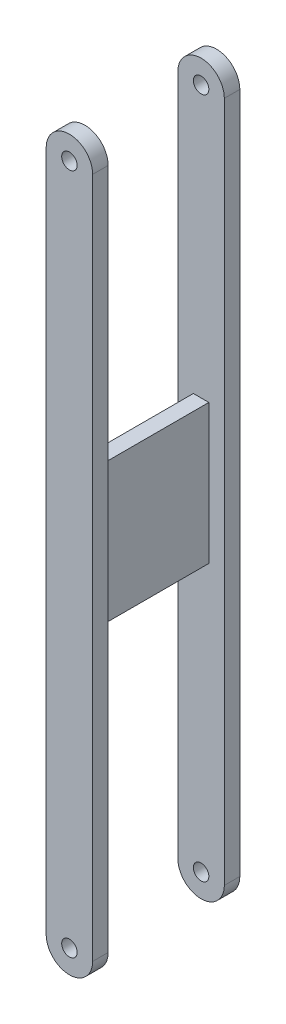
ISO-10303-21;
HEADER;
FILE_DESCRIPTION(('STEP AP214'),'2;1');
FILE_NAME('part.step','',(''),(''),'','','');
FILE_SCHEMA(('AUTOMOTIVE_DESIGN { 1 0 10303 214 1 1 1 1 }'));
ENDSEC;
DATA;
#1=APPLICATION_CONTEXT('core data for automotive mechanical design processes');
#2=APPLICATION_PROTOCOL_DEFINITION('international standard','automotive_design',2000,#1);
#3=PRODUCT_CONTEXT('',#1,'mechanical');
#4=PRODUCT('Part','Part','',(#3));
#5=PRODUCT_RELATED_PRODUCT_CATEGORY('part','',(#4));
#6=PRODUCT_DEFINITION_FORMATION('','',#4);
#7=PRODUCT_DEFINITION_CONTEXT('part definition',#1,'design');
#8=PRODUCT_DEFINITION('design','',#6,#7);
#9=PRODUCT_DEFINITION_SHAPE('','',#8);
#10=(LENGTH_UNIT() NAMED_UNIT(*) SI_UNIT(.MILLI.,.METRE.));
#11=(NAMED_UNIT(*) PLANE_ANGLE_UNIT() SI_UNIT($,.RADIAN.));
#12=(NAMED_UNIT(*) SI_UNIT($,.STERADIAN.) SOLID_ANGLE_UNIT());
#13=UNCERTAINTY_MEASURE_WITH_UNIT(LENGTH_MEASURE(1.E-05),#10,'distance_accuracy_value','');
#14=(GEOMETRIC_REPRESENTATION_CONTEXT(3) GLOBAL_UNCERTAINTY_ASSIGNED_CONTEXT((#13)) GLOBAL_UNIT_ASSIGNED_CONTEXT((#10,
#11,#12)) REPRESENTATION_CONTEXT('',''));
#15=CARTESIAN_POINT('',(0.,0.,0.));
#16=DIRECTION('',(0.,0.,1.));
#17=DIRECTION('',(1.,0.,0.));
#18=AXIS2_PLACEMENT_3D('',#15,#16,#17);
#19=CARTESIAN_POINT('',(0.,0.,4.));
#20=DIRECTION('',(0.,0.,-1.));
#21=DIRECTION('',(-1.,0.,0.));
#22=AXIS2_PLACEMENT_3D('',#19,#20,#21);
#23=PLANE('',#22);
#24=DIRECTION('',(0.,-1.,0.));
#25=VECTOR('',#24,1.);
#26=CARTESIAN_POINT('',(0.,0.,4.));
#27=LINE('',#26,#25);
#28=CARTESIAN_POINT('',(0.,182.,4.));
#29=VERTEX_POINT('',#28);
#30=CARTESIAN_POINT('',(0.,6.,4.));
#31=VERTEX_POINT('',#30);
#32=EDGE_CURVE('E210',#29,#31,#27,.T.);
#33=ORIENTED_EDGE('',*,*,#32,.T.);
#34=CARTESIAN_POINT('',(6.00000000000001,6.,4.));
#35=DIRECTION('',(0.,0.,-1.));
#36=DIRECTION('',(-1.,0.,0.));
#37=AXIS2_PLACEMENT_3D('',#34,#35,#36);
#38=CIRCLE('',#37,6.00000000000001);
#39=CARTESIAN_POINT('',(12.,6.,4.));
#40=VERTEX_POINT('',#39);
#41=EDGE_CURVE('E182',#31,#40,#38,.F.);
#42=ORIENTED_EDGE('',*,*,#41,.T.);
#43=DIRECTION('',(0.,1.,0.));
#44=VECTOR('',#43,1.);
#45=CARTESIAN_POINT('',(12.,0.,4.));
#46=LINE('',#45,#44);
#47=CARTESIAN_POINT('',(12.,182.,4.));
#48=VERTEX_POINT('',#47);
#49=EDGE_CURVE('E213',#40,#48,#46,.T.);
#50=ORIENTED_EDGE('',*,*,#49,.T.);
#51=CARTESIAN_POINT('',(6.00000000000002,182.,4.));
#52=DIRECTION('',(0.,0.,-1.));
#53=DIRECTION('',(-1.,0.,0.));
#54=AXIS2_PLACEMENT_3D('',#51,#52,#53);
#55=CIRCLE('',#54,6.00000000000001);
#56=EDGE_CURVE('E197',#48,#29,#55,.F.);
#57=ORIENTED_EDGE('',*,*,#56,.T.);
#58=EDGE_LOOP('',(#33,#42,#50,#57));
#59=FACE_BOUND('',#58,.T.);
#60=CARTESIAN_POINT('',(6.00000000000002,182.,4.));
#61=DIRECTION('',(0.,0.,-1.));
#62=DIRECTION('',(-1.,0.,0.));
#63=AXIS2_PLACEMENT_3D('',#60,#61,#62);
#64=CIRCLE('',#63,2.);
#65=CARTESIAN_POINT('',(4.00000000000002,182.,4.));
#66=VERTEX_POINT('',#65);
#67=EDGE_CURVE('E149',#66,#66,#64,.T.);
#68=ORIENTED_EDGE('',*,*,#67,.T.);
#69=EDGE_LOOP('',(#68));
#70=FACE_BOUND('',#69,.T.);
#71=CARTESIAN_POINT('',(6.,6.,4.));
#72=DIRECTION('',(0.,0.,-1.));
#73=DIRECTION('',(-1.,0.,0.));
#74=AXIS2_PLACEMENT_3D('',#71,#72,#73);
#75=CIRCLE('',#74,2.);
#76=CARTESIAN_POINT('',(4.,6.,4.));
#77=VERTEX_POINT('',#76);
#78=EDGE_CURVE('E167',#77,#77,#75,.T.);
#79=ORIENTED_EDGE('',*,*,#78,.T.);
#80=EDGE_LOOP('',(#79));
#81=FACE_BOUND('',#80,.T.);
#82=DIRECTION('',(0.,-1.,0.));
#83=VECTOR('',#82,1.);
#84=CARTESIAN_POINT('',(4.,112.,4.));
#85=LINE('',#84,#83);
#86=CARTESIAN_POINT('',(4.,112.,4.));
#87=VERTEX_POINT('',#86);
#88=CARTESIAN_POINT('',(4.,76.,4.));
#89=VERTEX_POINT('',#88);
#90=EDGE_CURVE('E146',#87,#89,#85,.T.);
#91=ORIENTED_EDGE('',*,*,#90,.F.);
#92=DIRECTION('',(-1.,0.,0.));
#93=VECTOR('',#92,1.);
#94=CARTESIAN_POINT('',(4.,112.,4.));
#95=LINE('',#94,#93);
#96=CARTESIAN_POINT('',(8.00000000000002,112.,4.));
#97=VERTEX_POINT('',#96);
#98=EDGE_CURVE('E152',#97,#87,#95,.T.);
#99=ORIENTED_EDGE('',*,*,#98,.F.);
#100=DIRECTION('',(0.,1.,0.));
#101=VECTOR('',#100,1.);
#102=CARTESIAN_POINT('',(8.00000000000002,112.,4.));
#103=LINE('',#102,#101);
#104=CARTESIAN_POINT('',(8.00000000000003,76.,4.));
#105=VERTEX_POINT('',#104);
#106=EDGE_CURVE('E53',#105,#97,#103,.T.);
#107=ORIENTED_EDGE('',*,*,#106,.F.);
#108=DIRECTION('',(1.,0.,0.));
#109=VECTOR('',#108,1.);
#110=CARTESIAN_POINT('',(4.,76.,4.));
#111=LINE('',#110,#109);
#112=EDGE_CURVE('E48',#89,#105,#111,.T.);
#113=ORIENTED_EDGE('',*,*,#112,.F.);
#114=EDGE_LOOP('',(#91,#99,#107,#113));
#115=FACE_BOUND('',#114,.T.);
#116=ADVANCED_FACE('F33',(#59,#70,#81,#115),#23,.F.);
#117=CARTESIAN_POINT('',(0.,0.,34.));
#118=DIRECTION('',(0.,0.,1.));
#119=DIRECTION('',(1.,0.,0.));
#120=AXIS2_PLACEMENT_3D('',#117,#118,#119);
#121=PLANE('',#120);
#122=DIRECTION('',(0.,1.,0.));
#123=VECTOR('',#122,1.);
#124=CARTESIAN_POINT('',(12.,188.,34.));
#125=LINE('',#124,#123);
#126=CARTESIAN_POINT('',(12.,6.,34.));
#127=VERTEX_POINT('',#126);
#128=CARTESIAN_POINT('',(12.,182.,34.));
#129=VERTEX_POINT('',#128);
#130=EDGE_CURVE('E204',#127,#129,#125,.T.);
#131=ORIENTED_EDGE('',*,*,#130,.F.);
#132=CARTESIAN_POINT('',(6.00000000000001,6.,34.));
#133=DIRECTION('',(0.,0.,1.));
#134=DIRECTION('',(1.,0.,0.));
#135=AXIS2_PLACEMENT_3D('',#132,#133,#134);
#136=CIRCLE('',#135,6.00000000000001);
#137=CARTESIAN_POINT('',(0.,6.00000000000001,34.));
#138=VERTEX_POINT('',#137);
#139=EDGE_CURVE('E11',#127,#138,#136,.F.);
#140=ORIENTED_EDGE('',*,*,#139,.T.);
#141=DIRECTION('',(0.,-1.,0.));
#142=VECTOR('',#141,1.);
#143=CARTESIAN_POINT('',(0.,188.,34.));
#144=LINE('',#143,#142);
#145=CARTESIAN_POINT('',(0.,182.,34.));
#146=VERTEX_POINT('',#145);
#147=EDGE_CURVE('E199',#146,#138,#144,.T.);
#148=ORIENTED_EDGE('',*,*,#147,.F.);
#149=CARTESIAN_POINT('',(6.00000000000002,182.,34.));
#150=DIRECTION('',(0.,0.,1.));
#151=DIRECTION('',(1.,0.,0.));
#152=AXIS2_PLACEMENT_3D('',#149,#150,#151);
#153=CIRCLE('',#152,6.00000000000001);
#154=EDGE_CURVE('E41',#146,#129,#153,.F.);
#155=ORIENTED_EDGE('',*,*,#154,.T.);
#156=EDGE_LOOP('',(#131,#140,#148,#155));
#157=FACE_BOUND('',#156,.T.);
#158=CARTESIAN_POINT('',(6.,6.,34.));
#159=DIRECTION('',(0.,0.,1.));
#160=DIRECTION('',(1.,0.,0.));
#161=AXIS2_PLACEMENT_3D('',#158,#159,#160);
#162=CIRCLE('',#161,2.);
#163=CARTESIAN_POINT('',(8.,6.,34.));
#164=VERTEX_POINT('',#163);
#165=EDGE_CURVE('E161',#164,#164,#162,.T.);
#166=ORIENTED_EDGE('',*,*,#165,.T.);
#167=EDGE_LOOP('',(#166));
#168=FACE_BOUND('',#167,.T.);
#169=CARTESIAN_POINT('',(6.00000000000002,182.,34.));
#170=DIRECTION('',(0.,0.,1.));
#171=DIRECTION('',(1.,0.,0.));
#172=AXIS2_PLACEMENT_3D('',#169,#170,#171);
#173=CIRCLE('',#172,2.);
#174=CARTESIAN_POINT('',(8.00000000000002,182.,34.));
#175=VERTEX_POINT('',#174);
#176=EDGE_CURVE('E426',#175,#175,#173,.T.);
#177=ORIENTED_EDGE('',*,*,#176,.T.);
#178=EDGE_LOOP('',(#177));
#179=FACE_BOUND('',#178,.T.);
#180=DIRECTION('',(0.,-1.,0.));
#181=VECTOR('',#180,1.);
#182=CARTESIAN_POINT('',(4.,112.,34.));
#183=LINE('',#182,#181);
#184=CARTESIAN_POINT('',(4.,112.,34.));
#185=VERTEX_POINT('',#184);
#186=CARTESIAN_POINT('',(4.,76.,34.));
#187=VERTEX_POINT('',#186);
#188=EDGE_CURVE('E153',#185,#187,#183,.T.);
#189=ORIENTED_EDGE('',*,*,#188,.T.);
#190=DIRECTION('',(1.,0.,0.));
#191=VECTOR('',#190,1.);
#192=CARTESIAN_POINT('',(4.,76.,34.));
#193=LINE('',#192,#191);
#194=CARTESIAN_POINT('',(8.00000000000003,76.,34.));
#195=VERTEX_POINT('',#194);
#196=EDGE_CURVE('E126',#187,#195,#193,.T.);
#197=ORIENTED_EDGE('',*,*,#196,.T.);
#198=DIRECTION('',(0.,1.,0.));
#199=VECTOR('',#198,1.);
#200=CARTESIAN_POINT('',(8.00000000000002,112.,34.));
#201=LINE('',#200,#199);
#202=CARTESIAN_POINT('',(8.00000000000002,112.,34.));
#203=VERTEX_POINT('',#202);
#204=EDGE_CURVE('E119',#195,#203,#201,.T.);
#205=ORIENTED_EDGE('',*,*,#204,.T.);
#206=DIRECTION('',(-1.,0.,0.));
#207=VECTOR('',#206,1.);
#208=CARTESIAN_POINT('',(4.,112.,34.));
#209=LINE('',#208,#207);
#210=EDGE_CURVE('E123',#203,#185,#209,.T.);
#211=ORIENTED_EDGE('',*,*,#210,.T.);
#212=EDGE_LOOP('',(#189,#197,#205,#211));
#213=FACE_BOUND('',#212,.T.);
#214=ADVANCED_FACE('F121',(#157,#168,#179,#213),#121,.F.);
#215=CARTESIAN_POINT('',(0.,0.,4.));
#216=DIRECTION('',(1.,0.,0.));
#217=DIRECTION('',(0.,0.,-1.));
#218=AXIS2_PLACEMENT_3D('',#215,#216,#217);
#219=PLANE('',#218);
#220=DIRECTION('',(0.,0.,1.));
#221=VECTOR('',#220,1.);
#222=CARTESIAN_POINT('',(0.,6.,-36.));
#223=LINE('',#222,#221);
#224=CARTESIAN_POINT('',(0.,6.,0.));
#225=VERTEX_POINT('',#224);
#226=EDGE_CURVE('E177',#225,#31,#223,.T.);
#227=ORIENTED_EDGE('',*,*,#226,.T.);
#228=ORIENTED_EDGE('',*,*,#32,.F.);
#229=DIRECTION('',(0.,0.,1.));
#230=VECTOR('',#229,1.);
#231=CARTESIAN_POINT('',(0.,182.,-36.));
#232=LINE('',#231,#230);
#233=CARTESIAN_POINT('',(0.,182.,0.));
#234=VERTEX_POINT('',#233);
#235=EDGE_CURVE('E191',#234,#29,#232,.T.);
#236=ORIENTED_EDGE('',*,*,#235,.F.);
#237=DIRECTION('',(0.,-1.,0.));
#238=VECTOR('',#237,1.);
#239=CARTESIAN_POINT('',(0.,0.,0.));
#240=LINE('',#239,#238);
#241=EDGE_CURVE('E206',#234,#225,#240,.T.);
#242=ORIENTED_EDGE('',*,*,#241,.T.);
#243=EDGE_LOOP('',(#227,#228,#236,#242));
#244=FACE_BOUND('',#243,.T.);
#245=ADVANCED_FACE('F35',(#244),#219,.F.);
#246=CARTESIAN_POINT('',(0.,188.,38.));
#247=DIRECTION('',(1.,0.,0.));
#248=DIRECTION('',(0.,1.,0.));
#249=AXIS2_PLACEMENT_3D('',#246,#247,#248);
#250=PLANE('',#249);
#251=CARTESIAN_POINT('',(0.,6.,38.));
#252=VERTEX_POINT('',#251);
#253=EDGE_CURVE('E172',#138,#252,#223,.T.);
#254=ORIENTED_EDGE('',*,*,#253,.T.);
#255=DIRECTION('',(0.,-1.,0.));
#256=VECTOR('',#255,1.);
#257=CARTESIAN_POINT('',(0.,188.,38.));
#258=LINE('',#257,#256);
#259=CARTESIAN_POINT('',(0.,182.,38.));
#260=VERTEX_POINT('',#259);
#261=EDGE_CURVE('E200',#260,#252,#258,.T.);
#262=ORIENTED_EDGE('',*,*,#261,.F.);
#263=EDGE_CURVE('E188',#146,#260,#232,.T.);
#264=ORIENTED_EDGE('',*,*,#263,.F.);
#265=ORIENTED_EDGE('',*,*,#147,.T.);
#266=EDGE_LOOP('',(#254,#262,#264,#265));
#267=FACE_BOUND('',#266,.T.);
#268=ADVANCED_FACE('F229',(#267),#250,.F.);
#269=CARTESIAN_POINT('',(12.,0.,4.));
#270=DIRECTION('',(-1.,0.,0.));
#271=DIRECTION('',(0.,0.,1.));
#272=AXIS2_PLACEMENT_3D('',#269,#270,#271);
#273=PLANE('',#272);
#274=ORIENTED_EDGE('',*,*,#49,.F.);
#275=DIRECTION('',(0.,0.,1.));
#276=VECTOR('',#275,1.);
#277=CARTESIAN_POINT('',(12.,6.,-36.));
#278=LINE('',#277,#276);
#279=CARTESIAN_POINT('',(12.,6.,0.));
#280=VERTEX_POINT('',#279);
#281=EDGE_CURVE('E176',#280,#40,#278,.T.);
#282=ORIENTED_EDGE('',*,*,#281,.F.);
#283=DIRECTION('',(0.,1.,0.));
#284=VECTOR('',#283,1.);
#285=CARTESIAN_POINT('',(12.,0.,0.));
#286=LINE('',#285,#284);
#287=CARTESIAN_POINT('',(12.,182.,0.));
#288=VERTEX_POINT('',#287);
#289=EDGE_CURVE('E214',#280,#288,#286,.T.);
#290=ORIENTED_EDGE('',*,*,#289,.T.);
#291=DIRECTION('',(0.,0.,1.));
#292=VECTOR('',#291,1.);
#293=CARTESIAN_POINT('',(12.,182.,-36.));
#294=LINE('',#293,#292);
#295=EDGE_CURVE('E192',#288,#48,#294,.T.);
#296=ORIENTED_EDGE('',*,*,#295,.T.);
#297=EDGE_LOOP('',(#274,#282,#290,#296));
#298=FACE_BOUND('',#297,.T.);
#299=ADVANCED_FACE('F265',(#298),#273,.F.);
#300=CARTESIAN_POINT('',(12.,188.,38.));
#301=DIRECTION('',(-1.,0.,0.));
#302=DIRECTION('',(0.,-1.,0.));
#303=AXIS2_PLACEMENT_3D('',#300,#301,#302);
#304=PLANE('',#303);
#305=DIRECTION('',(0.,1.,0.));
#306=VECTOR('',#305,1.);
#307=CARTESIAN_POINT('',(12.,188.,38.));
#308=LINE('',#307,#306);
#309=CARTESIAN_POINT('',(12.,6.,38.));
#310=VERTEX_POINT('',#309);
#311=CARTESIAN_POINT('',(12.,182.,38.));
#312=VERTEX_POINT('',#311);
#313=EDGE_CURVE('E203',#310,#312,#308,.T.);
#314=ORIENTED_EDGE('',*,*,#313,.F.);
#315=EDGE_CURVE('E173',#127,#310,#278,.T.);
#316=ORIENTED_EDGE('',*,*,#315,.F.);
#317=ORIENTED_EDGE('',*,*,#130,.T.);
#318=EDGE_CURVE('E187',#129,#312,#294,.T.);
#319=ORIENTED_EDGE('',*,*,#318,.T.);
#320=EDGE_LOOP('',(#314,#316,#317,#319));
#321=FACE_BOUND('',#320,.T.);
#322=ADVANCED_FACE('F234',(#321),#304,.F.);
#323=CARTESIAN_POINT('',(0.,0.,0.));
#324=DIRECTION('',(0.,0.,-1.));
#325=DIRECTION('',(-1.,0.,0.));
#326=AXIS2_PLACEMENT_3D('',#323,#324,#325);
#327=PLANE('',#326);
#328=CARTESIAN_POINT('',(6.00000000000002,182.,0.));
#329=DIRECTION('',(0.,0.,1.));
#330=DIRECTION('',(1.,0.,0.));
#331=AXIS2_PLACEMENT_3D('',#328,#329,#330);
#332=CIRCLE('',#331,2.);
#333=CARTESIAN_POINT('',(8.00000000000002,182.,0.));
#334=VERTEX_POINT('',#333);
#335=EDGE_CURVE('E423',#334,#334,#332,.T.);
#336=ORIENTED_EDGE('',*,*,#335,.T.);
#337=EDGE_LOOP('',(#336));
#338=FACE_BOUND('',#337,.T.);
#339=CARTESIAN_POINT('',(6.,6.,0.));
#340=DIRECTION('',(0.,0.,-1.));
#341=DIRECTION('',(-1.,0.,0.));
#342=AXIS2_PLACEMENT_3D('',#339,#340,#341);
#343=CIRCLE('',#342,2.);
#344=CARTESIAN_POINT('',(4.,6.,0.));
#345=VERTEX_POINT('',#344);
#346=EDGE_CURVE('E164',#345,#345,#343,.T.);
#347=ORIENTED_EDGE('',*,*,#346,.F.);
#348=EDGE_LOOP('',(#347));
#349=FACE_BOUND('',#348,.T.);
#350=CARTESIAN_POINT('',(6.00000000000001,6.,0.));
#351=DIRECTION('',(0.,0.,-1.));
#352=DIRECTION('',(-1.,0.,0.));
#353=AXIS2_PLACEMENT_3D('',#350,#351,#352);
#354=CIRCLE('',#353,6.00000000000001);
#355=EDGE_CURVE('E180',#225,#280,#354,.F.);
#356=ORIENTED_EDGE('',*,*,#355,.F.);
#357=ORIENTED_EDGE('',*,*,#241,.F.);
#358=CARTESIAN_POINT('',(6.00000000000002,182.,0.));
#359=DIRECTION('',(0.,0.,-1.));
#360=DIRECTION('',(-1.,0.,0.));
#361=AXIS2_PLACEMENT_3D('',#358,#359,#360);
#362=CIRCLE('',#361,6.00000000000001);
#363=EDGE_CURVE('E195',#288,#234,#362,.F.);
#364=ORIENTED_EDGE('',*,*,#363,.F.);
#365=ORIENTED_EDGE('',*,*,#289,.F.);
#366=EDGE_LOOP('',(#356,#357,#364,#365));
#367=FACE_BOUND('',#366,.T.);
#368=ADVANCED_FACE('F262',(#338,#349,#367),#327,.T.);
#369=CARTESIAN_POINT('',(0.,0.,38.));
#370=DIRECTION('',(0.,0.,1.));
#371=DIRECTION('',(1.,0.,0.));
#372=AXIS2_PLACEMENT_3D('',#369,#370,#371);
#373=PLANE('',#372);
#374=CARTESIAN_POINT('',(6.00000000000002,182.,38.));
#375=DIRECTION('',(0.,0.,1.));
#376=DIRECTION('',(1.,0.,0.));
#377=AXIS2_PLACEMENT_3D('',#374,#375,#376);
#378=CIRCLE('',#377,2.);
#379=CARTESIAN_POINT('',(8.00000000000002,182.,38.));
#380=VERTEX_POINT('',#379);
#381=EDGE_CURVE('E433',#380,#380,#378,.T.);
#382=ORIENTED_EDGE('',*,*,#381,.F.);
#383=EDGE_LOOP('',(#382));
#384=FACE_BOUND('',#383,.T.);
#385=CARTESIAN_POINT('',(6.,6.,38.));
#386=DIRECTION('',(0.,0.,1.));
#387=DIRECTION('',(1.,0.,0.));
#388=AXIS2_PLACEMENT_3D('',#385,#386,#387);
#389=CIRCLE('',#388,2.);
#390=CARTESIAN_POINT('',(8.,6.,38.));
#391=VERTEX_POINT('',#390);
#392=EDGE_CURVE('E158',#391,#391,#389,.T.);
#393=ORIENTED_EDGE('',*,*,#392,.F.);
#394=EDGE_LOOP('',(#393));
#395=FACE_BOUND('',#394,.T.);
#396=CARTESIAN_POINT('',(6.00000000000001,6.,38.));
#397=DIRECTION('',(0.,0.,-1.));
#398=DIRECTION('',(1.,0.,0.));
#399=AXIS2_PLACEMENT_3D('',#396,#397,#398);
#400=CIRCLE('',#399,6.00000000000001);
#401=EDGE_CURVE('E170',#310,#252,#400,.T.);
#402=ORIENTED_EDGE('',*,*,#401,.F.);
#403=ORIENTED_EDGE('',*,*,#313,.T.);
#404=CARTESIAN_POINT('',(6.00000000000002,182.,38.));
#405=DIRECTION('',(0.,0.,-1.));
#406=DIRECTION('',(1.,0.,0.));
#407=AXIS2_PLACEMENT_3D('',#404,#405,#406);
#408=CIRCLE('',#407,6.00000000000001);
#409=EDGE_CURVE('E184',#260,#312,#408,.T.);
#410=ORIENTED_EDGE('',*,*,#409,.F.);
#411=ORIENTED_EDGE('',*,*,#261,.T.);
#412=EDGE_LOOP('',(#402,#403,#410,#411));
#413=FACE_BOUND('',#412,.T.);
#414=ADVANCED_FACE('F231',(#384,#395,#413),#373,.T.);
#415=CARTESIAN_POINT('',(6.00000000000002,182.,-36.));
#416=DIRECTION('',(0.,0.,1.));
#417=DIRECTION('',(1.,0.,0.));
#418=AXIS2_PLACEMENT_3D('',#415,#416,#417);
#419=CYLINDRICAL_SURFACE('',#418,6.00000000000001);
#420=ORIENTED_EDGE('',*,*,#409,.T.);
#421=ORIENTED_EDGE('',*,*,#318,.F.);
#422=ORIENTED_EDGE('',*,*,#154,.F.);
#423=ORIENTED_EDGE('',*,*,#263,.T.);
#424=EDGE_LOOP('',(#420,#421,#422,#423));
#425=FACE_BOUND('',#424,.T.);
#426=ADVANCED_FACE('F226',(#425),#419,.T.);
#427=ORIENTED_EDGE('',*,*,#56,.F.);
#428=ORIENTED_EDGE('',*,*,#295,.F.);
#429=ORIENTED_EDGE('',*,*,#363,.T.);
#430=ORIENTED_EDGE('',*,*,#235,.T.);
#431=EDGE_LOOP('',(#427,#428,#429,#430));
#432=FACE_BOUND('',#431,.T.);
#433=ADVANCED_FACE('F240',(#432),#419,.T.);
#434=CARTESIAN_POINT('',(6.00000000000001,6.,-36.));
#435=DIRECTION('',(0.,0.,1.));
#436=DIRECTION('',(1.,0.,0.));
#437=AXIS2_PLACEMENT_3D('',#434,#435,#436);
#438=CYLINDRICAL_SURFACE('',#437,6.00000000000001);
#439=ORIENTED_EDGE('',*,*,#401,.T.);
#440=ORIENTED_EDGE('',*,*,#253,.F.);
#441=ORIENTED_EDGE('',*,*,#139,.F.);
#442=ORIENTED_EDGE('',*,*,#315,.T.);
#443=EDGE_LOOP('',(#439,#440,#441,#442));
#444=FACE_BOUND('',#443,.T.);
#445=ADVANCED_FACE('F237',(#444),#438,.T.);
#446=ORIENTED_EDGE('',*,*,#41,.F.);
#447=ORIENTED_EDGE('',*,*,#226,.F.);
#448=ORIENTED_EDGE('',*,*,#355,.T.);
#449=ORIENTED_EDGE('',*,*,#281,.T.);
#450=EDGE_LOOP('',(#446,#447,#448,#449));
#451=FACE_BOUND('',#450,.T.);
#452=ADVANCED_FACE('F239',(#451),#438,.T.);
#453=CARTESIAN_POINT('',(6.,6.,-36.));
#454=DIRECTION('',(0.,0.,1.));
#455=DIRECTION('',(1.,0.,0.));
#456=AXIS2_PLACEMENT_3D('',#453,#454,#455);
#457=CYLINDRICAL_SURFACE('',#456,2.);
#458=ORIENTED_EDGE('',*,*,#392,.T.);
#459=EDGE_LOOP('',(#458));
#460=FACE_BOUND('',#459,.T.);
#461=ORIENTED_EDGE('',*,*,#165,.F.);
#462=EDGE_LOOP('',(#461));
#463=FACE_BOUND('',#462,.T.);
#464=ADVANCED_FACE('F246',(#460,#463),#457,.F.);
#465=ORIENTED_EDGE('',*,*,#346,.T.);
#466=EDGE_LOOP('',(#465));
#467=FACE_BOUND('',#466,.T.);
#468=ORIENTED_EDGE('',*,*,#78,.F.);
#469=EDGE_LOOP('',(#468));
#470=FACE_BOUND('',#469,.T.);
#471=ADVANCED_FACE('F330',(#467,#470),#457,.F.);
#472=CARTESIAN_POINT('',(4.,112.,34.));
#473=DIRECTION('',(1.,0.,0.));
#474=DIRECTION('',(0.,1.,0.));
#475=AXIS2_PLACEMENT_3D('',#472,#473,#474);
#476=PLANE('',#475);
#477=ORIENTED_EDGE('',*,*,#90,.T.);
#478=DIRECTION('',(0.,0.,-1.));
#479=VECTOR('',#478,1.);
#480=CARTESIAN_POINT('',(4.,76.,34.));
#481=LINE('',#480,#479);
#482=EDGE_CURVE('E156',#187,#89,#481,.T.);
#483=ORIENTED_EDGE('',*,*,#482,.F.);
#484=ORIENTED_EDGE('',*,*,#188,.F.);
#485=DIRECTION('',(0.,0.,-1.));
#486=VECTOR('',#485,1.);
#487=CARTESIAN_POINT('',(4.,112.,34.));
#488=LINE('',#487,#486);
#489=EDGE_CURVE('E137',#185,#87,#488,.T.);
#490=ORIENTED_EDGE('',*,*,#489,.T.);
#491=EDGE_LOOP('',(#477,#483,#484,#490));
#492=FACE_BOUND('',#491,.T.);
#493=ADVANCED_FACE('F338',(#492),#476,.F.);
#494=CARTESIAN_POINT('',(4.,76.,34.));
#495=DIRECTION('',(0.,1.,0.));
#496=DIRECTION('',(0.,0.,1.));
#497=AXIS2_PLACEMENT_3D('',#494,#495,#496);
#498=PLANE('',#497);
#499=ORIENTED_EDGE('',*,*,#112,.T.);
#500=DIRECTION('',(0.,0.,-1.));
#501=VECTOR('',#500,1.);
#502=CARTESIAN_POINT('',(8.00000000000003,76.,34.));
#503=LINE('',#502,#501);
#504=EDGE_CURVE('E136',#195,#105,#503,.T.);
#505=ORIENTED_EDGE('',*,*,#504,.F.);
#506=ORIENTED_EDGE('',*,*,#196,.F.);
#507=ORIENTED_EDGE('',*,*,#482,.T.);
#508=EDGE_LOOP('',(#499,#505,#506,#507));
#509=FACE_BOUND('',#508,.T.);
#510=ADVANCED_FACE('F356',(#509),#498,.F.);
#511=CARTESIAN_POINT('',(8.00000000000002,112.,34.));
#512=DIRECTION('',(-1.,0.,0.));
#513=DIRECTION('',(0.,-1.,0.));
#514=AXIS2_PLACEMENT_3D('',#511,#512,#513);
#515=PLANE('',#514);
#516=ORIENTED_EDGE('',*,*,#106,.T.);
#517=DIRECTION('',(0.,0.,-1.));
#518=VECTOR('',#517,1.);
#519=CARTESIAN_POINT('',(8.00000000000002,112.,34.));
#520=LINE('',#519,#518);
#521=EDGE_CURVE('E132',#203,#97,#520,.T.);
#522=ORIENTED_EDGE('',*,*,#521,.F.);
#523=ORIENTED_EDGE('',*,*,#204,.F.);
#524=ORIENTED_EDGE('',*,*,#504,.T.);
#525=EDGE_LOOP('',(#516,#522,#523,#524));
#526=FACE_BOUND('',#525,.T.);
#527=ADVANCED_FACE('F133',(#526),#515,.F.);
#528=CARTESIAN_POINT('',(4.,112.,34.));
#529=DIRECTION('',(0.,-1.,0.));
#530=DIRECTION('',(0.,0.,-1.));
#531=AXIS2_PLACEMENT_3D('',#528,#529,#530);
#532=PLANE('',#531);
#533=ORIENTED_EDGE('',*,*,#98,.T.);
#534=ORIENTED_EDGE('',*,*,#489,.F.);
#535=ORIENTED_EDGE('',*,*,#210,.F.);
#536=ORIENTED_EDGE('',*,*,#521,.T.);
#537=EDGE_LOOP('',(#533,#534,#535,#536));
#538=FACE_BOUND('',#537,.T.);
#539=ADVANCED_FACE('F139',(#538),#532,.F.);
#540=CARTESIAN_POINT('',(6.00000000000002,182.,0.));
#541=DIRECTION('',(0.,0.,1.));
#542=DIRECTION('',(1.,0.,0.));
#543=AXIS2_PLACEMENT_3D('',#540,#541,#542);
#544=CYLINDRICAL_SURFACE('',#543,2.);
#545=ORIENTED_EDGE('',*,*,#381,.T.);
#546=EDGE_LOOP('',(#545));
#547=FACE_BOUND('',#546,.T.);
#548=ORIENTED_EDGE('',*,*,#176,.F.);
#549=EDGE_LOOP('',(#548));
#550=FACE_BOUND('',#549,.T.);
#551=ADVANCED_FACE('F383',(#547,#550),#544,.F.);
#552=ORIENTED_EDGE('',*,*,#335,.F.);
#553=EDGE_LOOP('',(#552));
#554=FACE_BOUND('',#553,.T.);
#555=ORIENTED_EDGE('',*,*,#67,.F.);
#556=EDGE_LOOP('',(#555));
#557=FACE_BOUND('',#556,.T.);
#558=ADVANCED_FACE('F407',(#554,#557),#544,.F.);
#559=CLOSED_SHELL('',(#116,#214,#245,#268,#299,#322,#368,#414,#426,#433,#445,#452,#464,#471,
#493,#510,#527,#539,#551,#558));
#560=MANIFOLD_SOLID_BREP('B2',#559);
#561=ADVANCED_BREP_SHAPE_REPRESENTATION('',(#18,#560),#14);
#562=SHAPE_DEFINITION_REPRESENTATION(#9,#561);
ENDSEC;
END-ISO-10303-21;
